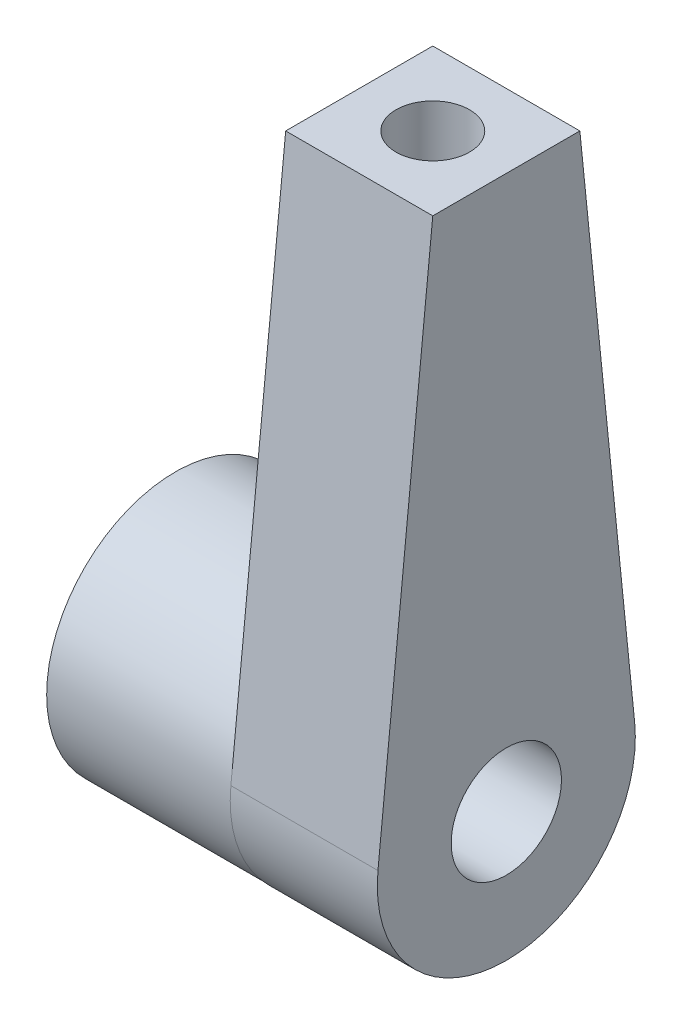
ISO-10303-21;
HEADER;
FILE_DESCRIPTION(('STEP AP214'),'2;1');
FILE_NAME('part.step','',(''),(''),'','','');
FILE_SCHEMA(('AUTOMOTIVE_DESIGN { 1 0 10303 214 1 1 1 1 }'));
ENDSEC;
DATA;
#1=APPLICATION_CONTEXT('core data for automotive mechanical design processes');
#2=APPLICATION_PROTOCOL_DEFINITION('international standard','automotive_design',2000,#1);
#3=PRODUCT_CONTEXT('',#1,'mechanical');
#4=PRODUCT('Part','Part','',(#3));
#5=PRODUCT_RELATED_PRODUCT_CATEGORY('part','',(#4));
#6=PRODUCT_DEFINITION_FORMATION('','',#4);
#7=PRODUCT_DEFINITION_CONTEXT('part definition',#1,'design');
#8=PRODUCT_DEFINITION('design','',#6,#7);
#9=PRODUCT_DEFINITION_SHAPE('','',#8);
#10=(LENGTH_UNIT() NAMED_UNIT(*) SI_UNIT(.MILLI.,.METRE.));
#11=(NAMED_UNIT(*) PLANE_ANGLE_UNIT() SI_UNIT($,.RADIAN.));
#12=(NAMED_UNIT(*) SI_UNIT($,.STERADIAN.) SOLID_ANGLE_UNIT());
#13=UNCERTAINTY_MEASURE_WITH_UNIT(LENGTH_MEASURE(1.E-05),#10,'distance_accuracy_value','');
#14=(GEOMETRIC_REPRESENTATION_CONTEXT(3) GLOBAL_UNCERTAINTY_ASSIGNED_CONTEXT((#13)) GLOBAL_UNIT_ASSIGNED_CONTEXT((#10,
#11,#12)) REPRESENTATION_CONTEXT('',''));
#15=CARTESIAN_POINT('',(0.,0.,0.));
#16=DIRECTION('',(0.,0.,1.));
#17=DIRECTION('',(1.,0.,0.));
#18=AXIS2_PLACEMENT_3D('',#15,#16,#17);
#19=CARTESIAN_POINT('',(-8.,0.,3.999999999999));
#20=DIRECTION('',(0.,-1.,0.));
#21=DIRECTION('',(0.,0.,-1.));
#22=AXIS2_PLACEMENT_3D('',#19,#20,#21);
#23=PLANE('',#22);
#24=CARTESIAN_POINT('',(-4.,0.,-9.98333360424652E-13));
#25=DIRECTION('',(0.,1.,0.));
#26=DIRECTION('',(0.,0.,1.));
#27=AXIS2_PLACEMENT_3D('',#24,#25,#26);
#28=CIRCLE('',#27,1.99999999999971);
#29=CARTESIAN_POINT('',(-4.,0.,1.99999999999871));
#30=VERTEX_POINT('',#29);
#31=EDGE_CURVE('E141',#30,#30,#28,.T.);
#32=ORIENTED_EDGE('',*,*,#31,.F.);
#33=EDGE_LOOP('',(#32));
#34=FACE_BOUND('',#33,.T.);
#35=DIRECTION('',(0.,0.,-1.));
#36=VECTOR('',#35,1.);
#37=CARTESIAN_POINT('',(0.,0.,3.999999999999));
#38=LINE('',#37,#36);
#39=CARTESIAN_POINT('',(0.,0.,3.999999999999));
#40=VERTEX_POINT('',#39);
#41=CARTESIAN_POINT('',(0.,0.,-4.000000000001));
#42=VERTEX_POINT('',#41);
#43=EDGE_CURVE('E120',#40,#42,#38,.T.);
#44=ORIENTED_EDGE('',*,*,#43,.T.);
#45=DIRECTION('',(1.,0.,0.));
#46=VECTOR('',#45,1.);
#47=CARTESIAN_POINT('',(-8.,0.,-4.000000000001));
#48=LINE('',#47,#46);
#49=CARTESIAN_POINT('',(-8.,0.,-4.000000000001));
#50=VERTEX_POINT('',#49);
#51=EDGE_CURVE('E57',#50,#42,#48,.T.);
#52=ORIENTED_EDGE('',*,*,#51,.F.);
#53=DIRECTION('',(0.,0.,-1.));
#54=VECTOR('',#53,1.);
#55=CARTESIAN_POINT('',(-8.,0.,3.999999999999));
#56=LINE('',#55,#54);
#57=CARTESIAN_POINT('',(-8.,0.,3.999999999999));
#58=VERTEX_POINT('',#57);
#59=EDGE_CURVE('E105',#58,#50,#56,.T.);
#60=ORIENTED_EDGE('',*,*,#59,.F.);
#61=DIRECTION('',(1.,0.,0.));
#62=VECTOR('',#61,1.);
#63=CARTESIAN_POINT('',(-8.,0.,3.999999999999));
#64=LINE('',#63,#62);
#65=EDGE_CURVE('E71',#58,#40,#64,.T.);
#66=ORIENTED_EDGE('',*,*,#65,.T.);
#67=EDGE_LOOP('',(#44,#52,#60,#66));
#68=FACE_BOUND('',#67,.T.);
#69=ADVANCED_FACE('F54',(#34,#68),#23,.F.);
#70=CARTESIAN_POINT('',(-8.,0.,-4.000000000001));
#71=DIRECTION('',(0.,-0.101056297182943,0.994880708828788));
#72=DIRECTION('',(0.,-0.994880708828789,-0.101056297182943));
#73=AXIS2_PLACEMENT_3D('',#70,#71,#72);
#74=PLANE('',#73);
#75=DIRECTION('',(0.,-0.994880708828789,-0.101056297182943));
#76=VECTOR('',#75,1.);
#77=CARTESIAN_POINT('',(0.,0.,-4.000000000001));
#78=LINE('',#77,#76);
#79=CARTESIAN_POINT('',(0.,-29.3489809104493,-6.98116076689782));
#80=VERTEX_POINT('',#79);
#81=EDGE_CURVE('E111',#42,#80,#78,.T.);
#82=ORIENTED_EDGE('',*,*,#81,.T.);
#83=DIRECTION('',(1.,0.,0.));
#84=VECTOR('',#83,1.);
#85=CARTESIAN_POINT('',(-8.,-29.3489809104493,-6.98116076689782));
#86=LINE('',#85,#84);
#87=CARTESIAN_POINT('',(-8.,-29.3489809104493,-6.98116076689782));
#88=VERTEX_POINT('',#87);
#89=EDGE_CURVE('E109',#88,#80,#86,.T.);
#90=ORIENTED_EDGE('',*,*,#89,.F.);
#91=DIRECTION('',(0.,-0.994880708828789,-0.101056297182943));
#92=VECTOR('',#91,1.);
#93=CARTESIAN_POINT('',(-8.,0.,-4.000000000001));
#94=LINE('',#93,#92);
#95=EDGE_CURVE('E97',#50,#88,#94,.T.);
#96=ORIENTED_EDGE('',*,*,#95,.F.);
#97=ORIENTED_EDGE('',*,*,#51,.T.);
#98=EDGE_LOOP('',(#82,#90,#96,#97));
#99=FACE_BOUND('',#98,.T.);
#100=ADVANCED_FACE('F110',(#99),#74,.F.);
#101=CARTESIAN_POINT('',(-8.,-30.0581013616559,-8.94927434632278E-13));
#102=DIRECTION('',(1.,0.,0.));
#103=DIRECTION('',(0.,0.,-1.));
#104=AXIS2_PLACEMENT_3D('',#101,#102,#103);
#105=CYLINDRICAL_SURFACE('',#104,7.01708325927378);
#106=CARTESIAN_POINT('',(0.,-30.0581013616559,-8.94927434632278E-13));
#107=DIRECTION('',(1.,0.,0.));
#108=DIRECTION('',(0.,0.,-1.));
#109=AXIS2_PLACEMENT_3D('',#106,#107,#108);
#110=CIRCLE('',#109,7.01708325927378);
#111=CARTESIAN_POINT('',(0.,-29.3489809104492,6.98116076689602));
#112=VERTEX_POINT('',#111);
#113=EDGE_CURVE('E124',#112,#80,#110,.T.);
#114=ORIENTED_EDGE('',*,*,#113,.F.);
#115=DIRECTION('',(1.,0.,0.));
#116=VECTOR('',#115,1.);
#117=CARTESIAN_POINT('',(-8.,-29.3489809104492,6.98116076689602));
#118=LINE('',#117,#116);
#119=CARTESIAN_POINT('',(-8.,-29.3489809104492,6.98116076689602));
#120=VERTEX_POINT('',#119);
#121=EDGE_CURVE('E85',#120,#112,#118,.T.);
#122=ORIENTED_EDGE('',*,*,#121,.F.);
#123=CARTESIAN_POINT('',(-8.,-30.0581013616559,-8.94927434632278E-13));
#124=DIRECTION('',(1.,0.,0.));
#125=DIRECTION('',(0.,0.,-1.));
#126=AXIS2_PLACEMENT_3D('',#123,#124,#125);
#127=CIRCLE('',#126,7.01708325927378);
#128=EDGE_CURVE('E104',#120,#88,#127,.T.);
#129=ORIENTED_EDGE('',*,*,#128,.T.);
#130=ORIENTED_EDGE('',*,*,#89,.T.);
#131=EDGE_LOOP('',(#114,#122,#129,#130));
#132=FACE_BOUND('',#131,.T.);
#133=ADVANCED_FACE('F114',(#132),#105,.T.);
#134=CARTESIAN_POINT('',(-8.,0.,3.999999999999));
#135=DIRECTION('',(0.,0.10105629718295,0.994880708828788));
#136=DIRECTION('',(0.,-0.994880708828788,0.10105629718295));
#137=AXIS2_PLACEMENT_3D('',#134,#135,#136);
#138=PLANE('',#137);
#139=DIRECTION('',(0.,-0.994880708828788,0.10105629718295));
#140=VECTOR('',#139,1.);
#141=CARTESIAN_POINT('',(0.,0.,3.999999999999));
#142=LINE('',#141,#140);
#143=EDGE_CURVE('E126',#40,#112,#142,.T.);
#144=ORIENTED_EDGE('',*,*,#143,.F.);
#145=ORIENTED_EDGE('',*,*,#65,.F.);
#146=DIRECTION('',(0.,-0.994880708828788,0.10105629718295));
#147=VECTOR('',#146,1.);
#148=CARTESIAN_POINT('',(-8.,0.,3.999999999999));
#149=LINE('',#148,#147);
#150=EDGE_CURVE('E115',#58,#120,#149,.T.);
#151=ORIENTED_EDGE('',*,*,#150,.T.);
#152=ORIENTED_EDGE('',*,*,#121,.T.);
#153=EDGE_LOOP('',(#144,#145,#151,#152));
#154=FACE_BOUND('',#153,.T.);
#155=ADVANCED_FACE('F158',(#154),#138,.T.);
#156=CARTESIAN_POINT('',(-8.,-30.0581013616559,-8.94927434632278E-13));
#157=DIRECTION('',(1.,0.,0.));
#158=DIRECTION('',(0.,0.,-1.));
#159=AXIS2_PLACEMENT_3D('',#156,#157,#158);
#160=PLANE('',#159);
#161=CARTESIAN_POINT('',(-8.,-30.0581013616559,-8.94927434632278E-13));
#162=DIRECTION('',(-1.,0.,0.));
#163=DIRECTION('',(0.,0.,1.));
#164=AXIS2_PLACEMENT_3D('',#161,#162,#163);
#165=CIRCLE('',#164,7.);
#166=CARTESIAN_POINT('',(-8.,-30.0581013616559,6.9999999999991));
#167=VERTEX_POINT('',#166);
#168=EDGE_CURVE('E12',#167,#167,#165,.T.);
#169=ORIENTED_EDGE('',*,*,#168,.F.);
#170=EDGE_LOOP('',(#169));
#171=FACE_BOUND('',#170,.T.);
#172=ORIENTED_EDGE('',*,*,#59,.T.);
#173=ORIENTED_EDGE('',*,*,#95,.T.);
#174=ORIENTED_EDGE('',*,*,#128,.F.);
#175=ORIENTED_EDGE('',*,*,#150,.F.);
#176=EDGE_LOOP('',(#172,#173,#174,#175));
#177=FACE_BOUND('',#176,.T.);
#178=ADVANCED_FACE('F101',(#171,#177),#160,.F.);
#179=CARTESIAN_POINT('',(0.,-30.0581013616559,-8.94927434632278E-13));
#180=DIRECTION('',(1.,0.,0.));
#181=DIRECTION('',(0.,0.,-1.));
#182=AXIS2_PLACEMENT_3D('',#179,#180,#181);
#183=PLANE('',#182);
#184=CARTESIAN_POINT('',(0.,-30.0581013616559,-8.94927434632278E-13));
#185=DIRECTION('',(1.,0.,0.));
#186=DIRECTION('',(0.,0.,-1.));
#187=AXIS2_PLACEMENT_3D('',#184,#185,#186);
#188=CIRCLE('',#187,3.);
#189=CARTESIAN_POINT('',(0.,-30.0581013616559,-3.0000000000009));
#190=VERTEX_POINT('',#189);
#191=EDGE_CURVE('E122',#190,#190,#188,.T.);
#192=ORIENTED_EDGE('',*,*,#191,.F.);
#193=EDGE_LOOP('',(#192));
#194=FACE_BOUND('',#193,.T.);
#195=ORIENTED_EDGE('',*,*,#43,.F.);
#196=ORIENTED_EDGE('',*,*,#143,.T.);
#197=ORIENTED_EDGE('',*,*,#113,.T.);
#198=ORIENTED_EDGE('',*,*,#81,.F.);
#199=EDGE_LOOP('',(#195,#196,#197,#198));
#200=FACE_BOUND('',#199,.T.);
#201=ADVANCED_FACE('F157',(#194,#200),#183,.T.);
#202=CARTESIAN_POINT('',(-8.,-30.0581013616559,-8.94927434632278E-13));
#203=DIRECTION('',(1.,0.,0.));
#204=DIRECTION('',(0.,0.,-1.));
#205=AXIS2_PLACEMENT_3D('',#202,#203,#204);
#206=CYLINDRICAL_SURFACE('',#205,3.);
#207=ORIENTED_EDGE('',*,*,#191,.T.);
#208=EDGE_LOOP('',(#207));
#209=FACE_BOUND('',#208,.T.);
#210=CARTESIAN_POINT('',(-18.,-30.0581013616559,-8.94927434632278E-13));
#211=DIRECTION('',(-1.,0.,0.));
#212=DIRECTION('',(0.,0.,1.));
#213=AXIS2_PLACEMENT_3D('',#210,#211,#212);
#214=CIRCLE('',#213,3.);
#215=CARTESIAN_POINT('',(-18.,-30.0581013616559,2.99999999999911));
#216=VERTEX_POINT('',#215);
#217=EDGE_CURVE('E137',#216,#216,#214,.F.);
#218=ORIENTED_EDGE('',*,*,#217,.F.);
#219=EDGE_LOOP('',(#218));
#220=FACE_BOUND('',#219,.T.);
#221=ADVANCED_FACE('F192',(#209,#220),#206,.F.);
#222=CARTESIAN_POINT('',(-18.,-30.0581013616559,-8.94927434632278E-13));
#223=DIRECTION('',(1.,0.,0.));
#224=DIRECTION('',(0.,0.,-1.));
#225=AXIS2_PLACEMENT_3D('',#222,#223,#224);
#226=CYLINDRICAL_SURFACE('',#225,7.);
#227=CARTESIAN_POINT('',(-18.,-30.0581013616559,-8.94927434632278E-13));
#228=DIRECTION('',(-1.,0.,0.));
#229=DIRECTION('',(0.,0.,1.));
#230=AXIS2_PLACEMENT_3D('',#227,#228,#229);
#231=CIRCLE('',#230,7.);
#232=CARTESIAN_POINT('',(-18.,-30.0581013616559,6.9999999999991));
#233=VERTEX_POINT('',#232);
#234=EDGE_CURVE('E133',#233,#233,#231,.T.);
#235=ORIENTED_EDGE('',*,*,#234,.F.);
#236=EDGE_LOOP('',(#235));
#237=FACE_BOUND('',#236,.T.);
#238=ORIENTED_EDGE('',*,*,#168,.T.);
#239=EDGE_LOOP('',(#238));
#240=FACE_BOUND('',#239,.T.);
#241=ADVANCED_FACE('F207',(#237,#240),#226,.T.);
#242=CARTESIAN_POINT('',(-18.,-30.0581013616559,-8.94927434632278E-13));
#243=DIRECTION('',(-1.,0.,0.));
#244=DIRECTION('',(0.,0.,1.));
#245=AXIS2_PLACEMENT_3D('',#242,#243,#244);
#246=PLANE('',#245);
#247=ORIENTED_EDGE('',*,*,#217,.T.);
#248=EDGE_LOOP('',(#247));
#249=FACE_BOUND('',#248,.T.);
#250=ORIENTED_EDGE('',*,*,#234,.T.);
#251=EDGE_LOOP('',(#250));
#252=FACE_BOUND('',#251,.T.);
#253=ADVANCED_FACE('F152',(#249,#252),#246,.T.);
#254=CARTESIAN_POINT('',(-4.,-22.,-9.98333360424652E-13));
#255=DIRECTION('',(0.,1.,0.));
#256=DIRECTION('',(0.,0.,1.));
#257=AXIS2_PLACEMENT_3D('',#254,#255,#256);
#258=CYLINDRICAL_SURFACE('',#257,1.99999999999971);
#259=CARTESIAN_POINT('',(-4.,-22.,-9.98333360424652E-13));
#260=DIRECTION('',(0.,1.,0.));
#261=DIRECTION('',(0.,0.,1.));
#262=AXIS2_PLACEMENT_3D('',#259,#260,#261);
#263=CIRCLE('',#262,1.99999999999971);
#264=CARTESIAN_POINT('',(-4.,-22.,1.99999999999871));
#265=VERTEX_POINT('',#264);
#266=EDGE_CURVE('E140',#265,#265,#263,.T.);
#267=ORIENTED_EDGE('',*,*,#266,.F.);
#268=EDGE_LOOP('',(#267));
#269=FACE_BOUND('',#268,.T.);
#270=ORIENTED_EDGE('',*,*,#31,.T.);
#271=EDGE_LOOP('',(#270));
#272=FACE_BOUND('',#271,.T.);
#273=ADVANCED_FACE('F149',(#269,#272),#258,.F.);
#274=CARTESIAN_POINT('',(-4.,-22.,-9.98333360424652E-13));
#275=DIRECTION('',(0.,1.,0.));
#276=DIRECTION('',(0.,0.,1.));
#277=AXIS2_PLACEMENT_3D('',#274,#275,#276);
#278=PLANE('',#277);
#279=ORIENTED_EDGE('',*,*,#266,.T.);
#280=EDGE_LOOP('',(#279));
#281=FACE_BOUND('',#280,.T.);
#282=ADVANCED_FACE('F147',(#281),#278,.T.);
#283=CLOSED_SHELL('',(#69,#100,#133,#155,#178,#201,#221,#241,#253,#273,#282));
#284=MANIFOLD_SOLID_BREP('B2',#283);
#285=ADVANCED_BREP_SHAPE_REPRESENTATION('',(#18,#284),#14);
#286=SHAPE_DEFINITION_REPRESENTATION(#9,#285);
ENDSEC;
END-ISO-10303-21;
